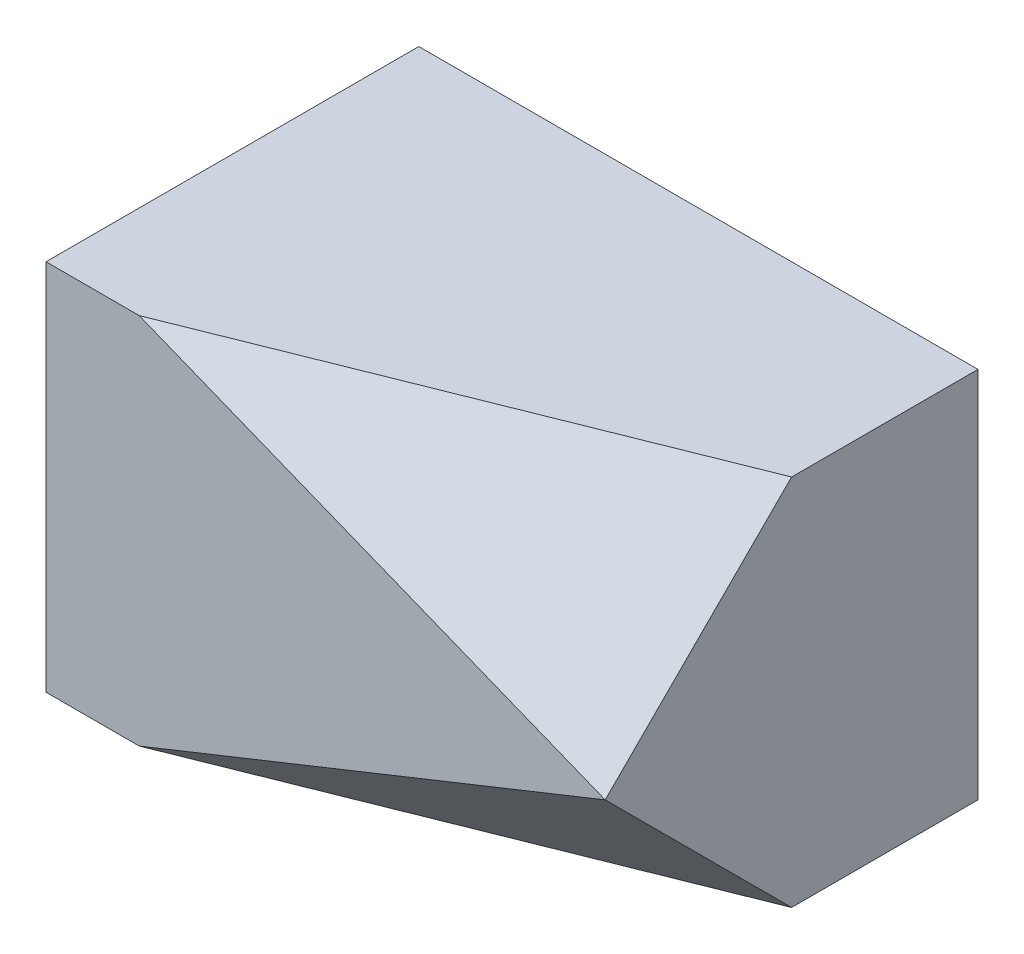
ISO-10303-21;
HEADER;
FILE_DESCRIPTION(('STEP AP214'),'2;1');
FILE_NAME('part.step','',(''),(''),'','','');
FILE_SCHEMA(('AUTOMOTIVE_DESIGN { 1 0 10303 214 1 1 1 1 }'));
ENDSEC;
DATA;
#1=APPLICATION_CONTEXT('core data for automotive mechanical design processes');
#2=APPLICATION_PROTOCOL_DEFINITION('international standard','automotive_design',2000,#1);
#3=PRODUCT_CONTEXT('',#1,'mechanical');
#4=PRODUCT('Part','Part','',(#3));
#5=PRODUCT_RELATED_PRODUCT_CATEGORY('part','',(#4));
#6=PRODUCT_DEFINITION_FORMATION('','',#4);
#7=PRODUCT_DEFINITION_CONTEXT('part definition',#1,'design');
#8=PRODUCT_DEFINITION('design','',#6,#7);
#9=PRODUCT_DEFINITION_SHAPE('','',#8);
#10=(LENGTH_UNIT() NAMED_UNIT(*) SI_UNIT(.MILLI.,.METRE.));
#11=(NAMED_UNIT(*) PLANE_ANGLE_UNIT() SI_UNIT($,.RADIAN.));
#12=(NAMED_UNIT(*) SI_UNIT($,.STERADIAN.) SOLID_ANGLE_UNIT());
#13=UNCERTAINTY_MEASURE_WITH_UNIT(LENGTH_MEASURE(1.E-05),#10,'distance_accuracy_value','');
#14=(GEOMETRIC_REPRESENTATION_CONTEXT(3) GLOBAL_UNCERTAINTY_ASSIGNED_CONTEXT((#13)) GLOBAL_UNIT_ASSIGNED_CONTEXT((#10,
#11,#12)) REPRESENTATION_CONTEXT('',''));
#15=CARTESIAN_POINT('',(0.,0.,0.));
#16=DIRECTION('',(0.,0.,1.));
#17=DIRECTION('',(1.,0.,0.));
#18=AXIS2_PLACEMENT_3D('',#15,#16,#17);
#19=CARTESIAN_POINT('',(-25.,-20.,40.));
#20=DIRECTION('',(0.,1.,0.));
#21=DIRECTION('',(0.,0.,1.));
#22=AXIS2_PLACEMENT_3D('',#19,#20,#21);
#23=PLANE('',#22);
#24=DIRECTION('',(0.,0.,-1.));
#25=VECTOR('',#24,1.);
#26=CARTESIAN_POINT('',(25.,-20.,40.));
#27=LINE('',#26,#25);
#28=CARTESIAN_POINT('',(25.,-20.,20.));
#29=VERTEX_POINT('',#28);
#30=CARTESIAN_POINT('',(25.,-20.,0.));
#31=VERTEX_POINT('',#30);
#32=EDGE_CURVE('E135',#29,#31,#27,.T.);
#33=ORIENTED_EDGE('',*,*,#32,.F.);
#34=DIRECTION('',(-0.928476690885259,0.,0.371390676354104));
#35=VECTOR('',#34,1.);
#36=CARTESIAN_POINT('',(-25.,-20.,40.));
#37=LINE('',#36,#35);
#38=CARTESIAN_POINT('',(-25.,-20.,40.));
#39=VERTEX_POINT('',#38);
#40=EDGE_CURVE('E48',#29,#39,#37,.T.);
#41=ORIENTED_EDGE('',*,*,#40,.T.);
#42=DIRECTION('',(1.,0.,0.));
#43=VECTOR('',#42,1.);
#44=CARTESIAN_POINT('',(-25.,-20.,40.));
#45=LINE('',#44,#43);
#46=CARTESIAN_POINT('',(-35.,-20.,40.));
#47=VERTEX_POINT('',#46);
#48=EDGE_CURVE('E118',#47,#39,#45,.T.);
#49=ORIENTED_EDGE('',*,*,#48,.F.);
#50=DIRECTION('',(0.,0.,1.));
#51=VECTOR('',#50,1.);
#52=CARTESIAN_POINT('',(-35.,-20.,0.));
#53=LINE('',#52,#51);
#54=CARTESIAN_POINT('',(-35.,-20.,0.));
#55=VERTEX_POINT('',#54);
#56=EDGE_CURVE('E112',#55,#47,#53,.T.);
#57=ORIENTED_EDGE('',*,*,#56,.F.);
#58=DIRECTION('',(1.,0.,0.));
#59=VECTOR('',#58,1.);
#60=CARTESIAN_POINT('',(-25.,-20.,0.));
#61=LINE('',#60,#59);
#62=EDGE_CURVE('E101',#55,#31,#61,.T.);
#63=ORIENTED_EDGE('',*,*,#62,.T.);
#64=EDGE_LOOP('',(#33,#41,#49,#57,#63));
#65=FACE_BOUND('',#64,.T.);
#66=ADVANCED_FACE('F39',(#65),#23,.F.);
#67=CARTESIAN_POINT('',(25.,20.,40.));
#68=DIRECTION('',(-1.,0.,0.));
#69=DIRECTION('',(0.,-1.,0.));
#70=AXIS2_PLACEMENT_3D('',#67,#68,#69);
#71=PLANE('',#70);
#72=DIRECTION('',(0.,-0.707106781186547,0.707106781186547));
#73=VECTOR('',#72,1.);
#74=CARTESIAN_POINT('',(25.,9.99999999999999,30.));
#75=LINE('',#74,#73);
#76=CARTESIAN_POINT('',(25.,20.,20.));
#77=VERTEX_POINT('',#76);
#78=CARTESIAN_POINT('',(25.,0.,40.));
#79=VERTEX_POINT('',#78);
#80=EDGE_CURVE('E140',#77,#79,#75,.T.);
#81=ORIENTED_EDGE('',*,*,#80,.T.);
#82=DIRECTION('',(0.,-0.707106781186548,-0.707106781186548));
#83=VECTOR('',#82,1.);
#84=CARTESIAN_POINT('',(25.,10.,50.));
#85=LINE('',#84,#83);
#86=EDGE_CURVE('E55',#79,#29,#85,.T.);
#87=ORIENTED_EDGE('',*,*,#86,.T.);
#88=ORIENTED_EDGE('',*,*,#32,.T.);
#89=DIRECTION('',(0.,1.,0.));
#90=VECTOR('',#89,1.);
#91=CARTESIAN_POINT('',(25.,20.,0.));
#92=LINE('',#91,#90);
#93=CARTESIAN_POINT('',(25.,20.,0.));
#94=VERTEX_POINT('',#93);
#95=EDGE_CURVE('E102',#31,#94,#92,.T.);
#96=ORIENTED_EDGE('',*,*,#95,.T.);
#97=DIRECTION('',(0.,0.,-1.));
#98=VECTOR('',#97,1.);
#99=CARTESIAN_POINT('',(25.,20.,40.));
#100=LINE('',#99,#98);
#101=EDGE_CURVE('E95',#77,#94,#100,.T.);
#102=ORIENTED_EDGE('',*,*,#101,.F.);
#103=EDGE_LOOP('',(#81,#87,#88,#96,#102));
#104=FACE_BOUND('',#103,.T.);
#105=ADVANCED_FACE('F41',(#104),#71,.F.);
#106=CARTESIAN_POINT('',(-25.,20.,40.));
#107=DIRECTION('',(0.,-1.,0.));
#108=DIRECTION('',(0.,0.,-1.));
#109=AXIS2_PLACEMENT_3D('',#106,#107,#108);
#110=PLANE('',#109);
#111=DIRECTION('',(-1.,0.,0.));
#112=VECTOR('',#111,1.);
#113=CARTESIAN_POINT('',(-25.,20.,0.));
#114=LINE('',#113,#112);
#115=CARTESIAN_POINT('',(-35.,20.,0.));
#116=VERTEX_POINT('',#115);
#117=EDGE_CURVE('E90',#94,#116,#114,.T.);
#118=ORIENTED_EDGE('',*,*,#117,.T.);
#119=DIRECTION('',(0.,0.,1.));
#120=VECTOR('',#119,1.);
#121=CARTESIAN_POINT('',(-35.,20.,0.));
#122=LINE('',#121,#120);
#123=CARTESIAN_POINT('',(-35.,20.,40.));
#124=VERTEX_POINT('',#123);
#125=EDGE_CURVE('E93',#116,#124,#122,.T.);
#126=ORIENTED_EDGE('',*,*,#125,.T.);
#127=DIRECTION('',(-1.,0.,0.));
#128=VECTOR('',#127,1.);
#129=CARTESIAN_POINT('',(-25.,20.,40.));
#130=LINE('',#129,#128);
#131=CARTESIAN_POINT('',(-25.,20.,40.));
#132=VERTEX_POINT('',#131);
#133=EDGE_CURVE('E124',#132,#124,#130,.T.);
#134=ORIENTED_EDGE('',*,*,#133,.F.);
#135=DIRECTION('',(0.928476690885259,0.,-0.371390676354104));
#136=VECTOR('',#135,1.);
#137=CARTESIAN_POINT('',(-25.,20.,40.));
#138=LINE('',#137,#136);
#139=EDGE_CURVE('E63',#132,#77,#138,.T.);
#140=ORIENTED_EDGE('',*,*,#139,.T.);
#141=ORIENTED_EDGE('',*,*,#101,.T.);
#142=EDGE_LOOP('',(#118,#126,#134,#140,#141));
#143=FACE_BOUND('',#142,.T.);
#144=ADVANCED_FACE('F92',(#143),#110,.F.);
#145=CARTESIAN_POINT('',(0.,0.,40.));
#146=DIRECTION('',(0.,0.,1.));
#147=DIRECTION('',(1.,0.,0.));
#148=AXIS2_PLACEMENT_3D('',#145,#146,#147);
#149=PLANE('',#148);
#150=DIRECTION('',(-0.928476690885259,-0.371390676354104,0.));
#151=VECTOR('',#150,1.);
#152=CARTESIAN_POINT('',(3.44827586206897,-8.62068965517241,40.));
#153=LINE('',#152,#151);
#154=EDGE_CURVE('E11',#79,#39,#153,.T.);
#155=ORIENTED_EDGE('',*,*,#154,.F.);
#156=DIRECTION('',(0.928476690885259,-0.371390676354104,0.));
#157=VECTOR('',#156,1.);
#158=CARTESIAN_POINT('',(3.44827586206896,8.6206896551724,40.));
#159=LINE('',#158,#157);
#160=EDGE_CURVE('E145',#132,#79,#159,.T.);
#161=ORIENTED_EDGE('',*,*,#160,.F.);
#162=ORIENTED_EDGE('',*,*,#133,.T.);
#163=DIRECTION('',(0.,-1.,0.));
#164=VECTOR('',#163,1.);
#165=CARTESIAN_POINT('',(-35.,20.,40.));
#166=LINE('',#165,#164);
#167=EDGE_CURVE('E109',#124,#47,#166,.T.);
#168=ORIENTED_EDGE('',*,*,#167,.T.);
#169=ORIENTED_EDGE('',*,*,#48,.T.);
#170=EDGE_LOOP('',(#155,#161,#162,#168,#169));
#171=FACE_BOUND('',#170,.T.);
#172=ADVANCED_FACE('F157',(#171),#149,.T.);
#173=CARTESIAN_POINT('',(0.,0.,0.));
#174=DIRECTION('',(0.,0.,1.));
#175=DIRECTION('',(1.,0.,0.));
#176=AXIS2_PLACEMENT_3D('',#173,#174,#175);
#177=PLANE('',#176);
#178=ORIENTED_EDGE('',*,*,#95,.F.);
#179=ORIENTED_EDGE('',*,*,#62,.F.);
#180=DIRECTION('',(0.,-1.,0.));
#181=VECTOR('',#180,1.);
#182=CARTESIAN_POINT('',(-35.,20.,0.));
#183=LINE('',#182,#181);
#184=EDGE_CURVE('E107',#116,#55,#183,.T.);
#185=ORIENTED_EDGE('',*,*,#184,.F.);
#186=ORIENTED_EDGE('',*,*,#117,.F.);
#187=EDGE_LOOP('',(#178,#179,#185,#186));
#188=FACE_BOUND('',#187,.T.);
#189=ADVANCED_FACE('F114',(#188),#177,.F.);
#190=CARTESIAN_POINT('',(9.25925925925926,23.1481481481481,23.1481481481481));
#191=DIRECTION('',(-0.272165526975909,-0.680413817439772,-0.680413817439772));
#192=DIRECTION('',(0.,0.707106781186547,-0.707106781186547));
#193=AXIS2_PLACEMENT_3D('',#190,#191,#192);
#194=PLANE('',#193);
#195=ORIENTED_EDGE('',*,*,#80,.F.);
#196=ORIENTED_EDGE('',*,*,#139,.F.);
#197=ORIENTED_EDGE('',*,*,#160,.T.);
#198=EDGE_LOOP('',(#195,#196,#197));
#199=FACE_BOUND('',#198,.T.);
#200=ADVANCED_FACE('F160',(#199),#194,.F.);
#201=CARTESIAN_POINT('',(9.25925925925926,-23.1481481481481,23.1481481481481));
#202=DIRECTION('',(-0.272165526975909,0.680413817439772,-0.680413817439772));
#203=DIRECTION('',(0.,0.707106781186548,0.707106781186548));
#204=AXIS2_PLACEMENT_3D('',#201,#202,#203);
#205=PLANE('',#204);
#206=ORIENTED_EDGE('',*,*,#86,.F.);
#207=ORIENTED_EDGE('',*,*,#154,.T.);
#208=ORIENTED_EDGE('',*,*,#40,.F.);
#209=EDGE_LOOP('',(#206,#207,#208));
#210=FACE_BOUND('',#209,.T.);
#211=ADVANCED_FACE('F155',(#210),#205,.F.);
#212=CARTESIAN_POINT('',(-35.,20.,0.));
#213=DIRECTION('',(-1.,0.,0.));
#214=DIRECTION('',(0.,-1.,0.));
#215=AXIS2_PLACEMENT_3D('',#212,#213,#214);
#216=PLANE('',#215);
#217=ORIENTED_EDGE('',*,*,#167,.F.);
#218=ORIENTED_EDGE('',*,*,#125,.F.);
#219=ORIENTED_EDGE('',*,*,#184,.T.);
#220=ORIENTED_EDGE('',*,*,#56,.T.);
#221=EDGE_LOOP('',(#217,#218,#219,#220));
#222=FACE_BOUND('',#221,.T.);
#223=ADVANCED_FACE('F106',(#222),#216,.T.);
#224=CLOSED_SHELL('',(#66,#105,#144,#172,#189,#200,#211,#223));
#225=MANIFOLD_SOLID_BREP('B2',#224);
#226=ADVANCED_BREP_SHAPE_REPRESENTATION('',(#18,#225),#14);
#227=SHAPE_DEFINITION_REPRESENTATION(#9,#226);
ENDSEC;
END-ISO-10303-21;
